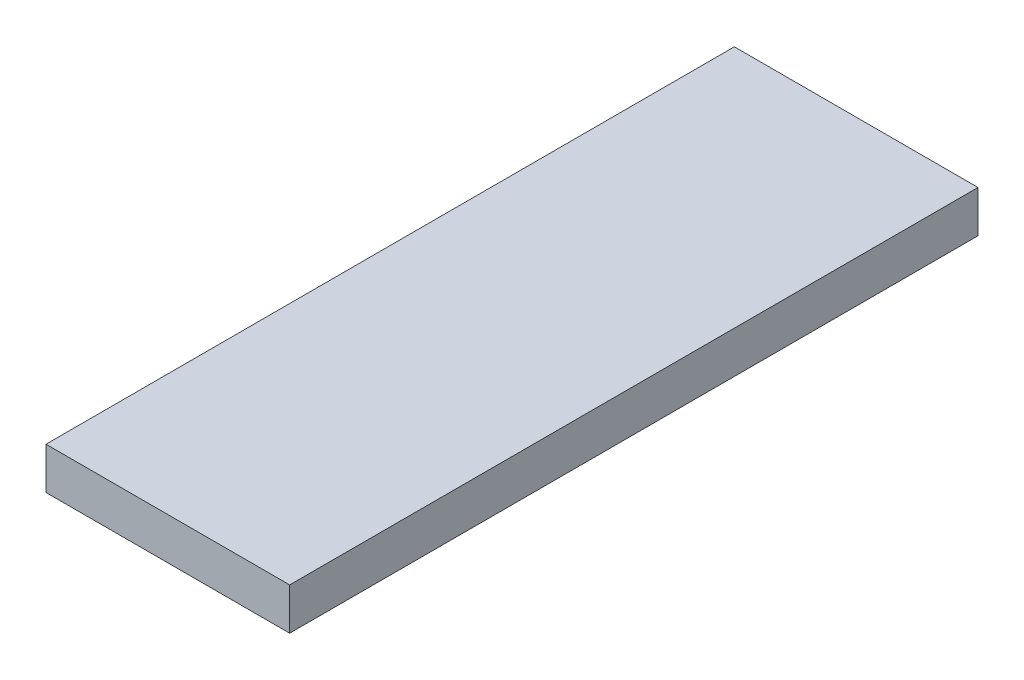
ISO-10303-21;
HEADER;
FILE_DESCRIPTION(('STEP AP214'),'2;1');
FILE_NAME('part.step','',(''),(''),'','','');
FILE_SCHEMA(('AUTOMOTIVE_DESIGN { 1 0 10303 214 1 1 1 1 }'));
ENDSEC;
DATA;
#1=APPLICATION_CONTEXT('core data for automotive mechanical design processes');
#2=APPLICATION_PROTOCOL_DEFINITION('international standard','automotive_design',2000,#1);
#3=PRODUCT_CONTEXT('',#1,'mechanical');
#4=PRODUCT('Part','Part','',(#3));
#5=PRODUCT_RELATED_PRODUCT_CATEGORY('part','',(#4));
#6=PRODUCT_DEFINITION_FORMATION('','',#4);
#7=PRODUCT_DEFINITION_CONTEXT('part definition',#1,'design');
#8=PRODUCT_DEFINITION('design','',#6,#7);
#9=PRODUCT_DEFINITION_SHAPE('','',#8);
#10=(LENGTH_UNIT() NAMED_UNIT(*) SI_UNIT(.MILLI.,.METRE.));
#11=(NAMED_UNIT(*) PLANE_ANGLE_UNIT() SI_UNIT($,.RADIAN.));
#12=(NAMED_UNIT(*) SI_UNIT($,.STERADIAN.) SOLID_ANGLE_UNIT());
#13=UNCERTAINTY_MEASURE_WITH_UNIT(LENGTH_MEASURE(1.E-05),#10,'distance_accuracy_value','');
#14=(GEOMETRIC_REPRESENTATION_CONTEXT(3) GLOBAL_UNCERTAINTY_ASSIGNED_CONTEXT((#13)) GLOBAL_UNIT_ASSIGNED_CONTEXT((#10,
#11,#12)) REPRESENTATION_CONTEXT('',''));
#15=CARTESIAN_POINT('',(0.,0.,0.));
#16=DIRECTION('',(0.,0.,1.));
#17=DIRECTION('',(1.,0.,0.));
#18=AXIS2_PLACEMENT_3D('',#15,#16,#17);
#19=CARTESIAN_POINT('',(-206.742838350957,-127.934098360656,0.));
#20=DIRECTION('',(0.,-1.,0.));
#21=DIRECTION('',(0.,0.,-1.));
#22=AXIS2_PLACEMENT_3D('',#19,#20,#21);
#23=PLANE('',#22);
#24=DIRECTION('',(0.5,0.,0.866025403784438));
#25=VECTOR('',#24,1.);
#26=CARTESIAN_POINT('',(0.989344262295071,-127.934098360656,-39.866406460551));
#27=LINE('',#26,#25);
#28=CARTESIAN_POINT('',(0.989344262295071,-127.934098360656,-39.866406460551));
#29=VERTEX_POINT('',#28);
#30=CARTESIAN_POINT('',(4.98934426229506,-127.934098360656,-32.9382032302755));
#31=VERTEX_POINT('',#30);
#32=EDGE_CURVE('E430',#29,#31,#27,.T.);
#33=ORIENTED_EDGE('',*,*,#32,.F.);
#34=DIRECTION('',(1.,0.,0.));
#35=VECTOR('',#34,1.);
#36=CARTESIAN_POINT('',(-7.01065573770493,-127.934098360656,-39.866406460551));
#37=LINE('',#36,#35);
#38=CARTESIAN_POINT('',(-7.01065573770493,-127.934098360656,-39.866406460551));
#39=VERTEX_POINT('',#38);
#40=EDGE_CURVE('E453',#39,#29,#37,.T.);
#41=ORIENTED_EDGE('',*,*,#40,.F.);
#42=DIRECTION('',(0.500000000000001,0.,-0.866025403784438));
#43=VECTOR('',#42,1.);
#44=CARTESIAN_POINT('',(-11.0106557377049,-127.934098360656,-32.9382032302755));
#45=LINE('',#44,#43);
#46=CARTESIAN_POINT('',(-11.0106557377049,-127.934098360656,-32.9382032302755));
#47=VERTEX_POINT('',#46);
#48=EDGE_CURVE('E484',#47,#39,#45,.T.);
#49=ORIENTED_EDGE('',*,*,#48,.F.);
#50=DIRECTION('',(-0.485739165099543,0.,-0.874103805899734));
#51=VECTOR('',#50,1.);
#52=CARTESIAN_POINT('',(-7.16065573770493,-127.934098360656,-26.01));
#53=LINE('',#52,#51);
#54=CARTESIAN_POINT('',(-7.16065573770493,-127.934098360656,-26.01));
#55=VERTEX_POINT('',#54);
#56=EDGE_CURVE('E480',#55,#47,#53,.T.);
#57=ORIENTED_EDGE('',*,*,#56,.F.);
#58=DIRECTION('',(-1.,0.,0.));
#59=VECTOR('',#58,1.);
#60=CARTESIAN_POINT('',(1.13934426229507,-127.934098360656,-26.01));
#61=LINE('',#60,#59);
#62=CARTESIAN_POINT('',(1.13934426229507,-127.934098360656,-26.01));
#63=VERTEX_POINT('',#62);
#64=EDGE_CURVE('E476',#63,#55,#61,.T.);
#65=ORIENTED_EDGE('',*,*,#64,.F.);
#66=DIRECTION('',(-0.485739165099541,0.,0.874103805899734));
#67=VECTOR('',#66,1.);
#68=CARTESIAN_POINT('',(4.98934426229506,-127.934098360656,-32.9382032302755));
#69=LINE('',#68,#67);
#70=EDGE_CURVE('E472',#31,#63,#69,.T.);
#71=ORIENTED_EDGE('',*,*,#70,.F.);
#72=EDGE_LOOP('',(#33,#41,#49,#57,#65,#71));
#73=FACE_BOUND('',#72,.T.);
#74=DIRECTION('',(0.,0.,1.));
#75=VECTOR('',#74,1.);
#76=CARTESIAN_POINT('',(-23.3606557377049,-127.934098360656,0.));
#77=LINE('',#76,#75);
#78=CARTESIAN_POINT('',(-23.3606557377049,-127.934098360656,-80.));
#79=VERTEX_POINT('',#78);
#80=CARTESIAN_POINT('',(-23.3606557377049,-127.934098360656,33.));
#81=VERTEX_POINT('',#80);
#82=EDGE_CURVE('E11',#79,#81,#77,.T.);
#83=ORIENTED_EDGE('',*,*,#82,.F.);
#84=DIRECTION('',(1.,0.,0.));
#85=VECTOR('',#84,1.);
#86=CARTESIAN_POINT('',(-206.742838350957,-127.934098360656,-80.));
#87=LINE('',#86,#85);
#88=CARTESIAN_POINT('',(16.6393442622951,-127.934098360656,-80.));
#89=VERTEX_POINT('',#88);
#90=EDGE_CURVE('E517',#79,#89,#87,.T.);
#91=ORIENTED_EDGE('',*,*,#90,.T.);
#92=DIRECTION('',(0.,0.,-1.));
#93=VECTOR('',#92,1.);
#94=CARTESIAN_POINT('',(16.6393442622951,-127.934098360656,0.));
#95=LINE('',#94,#93);
#96=CARTESIAN_POINT('',(16.6393442622951,-127.934098360656,33.));
#97=VERTEX_POINT('',#96);
#98=EDGE_CURVE('E256',#97,#89,#95,.T.);
#99=ORIENTED_EDGE('',*,*,#98,.F.);
#100=DIRECTION('',(1.,0.,0.));
#101=VECTOR('',#100,1.);
#102=CARTESIAN_POINT('',(-206.742838350957,-127.934098360656,33.));
#103=LINE('',#102,#101);
#104=EDGE_CURVE('E53',#81,#97,#103,.T.);
#105=ORIENTED_EDGE('',*,*,#104,.F.);
#106=EDGE_LOOP('',(#83,#91,#99,#105));
#107=FACE_BOUND('',#106,.T.);
#108=DIRECTION('',(-0.5,0.,0.866025403784438));
#109=VECTOR('',#108,1.);
#110=CARTESIAN_POINT('',(4.83934426229505,-127.934098360656,-52.9867967697245));
#111=LINE('',#110,#109);
#112=CARTESIAN_POINT('',(4.83934426229505,-127.934098360656,-52.9867967697245));
#113=VERTEX_POINT('',#112);
#114=CARTESIAN_POINT('',(0.839344262295044,-127.934098360656,-46.058593539449));
#115=VERTEX_POINT('',#114);
#116=EDGE_CURVE('E423',#113,#115,#111,.T.);
#117=ORIENTED_EDGE('',*,*,#116,.F.);
#118=DIRECTION('',(0.499999999999999,0.,0.866025403784439));
#119=VECTOR('',#118,1.);
#120=CARTESIAN_POINT('',(0.839344262295077,-127.934098360656,-59.915));
#121=LINE('',#120,#119);
#122=CARTESIAN_POINT('',(0.839344262295077,-127.934098360656,-59.915));
#123=VERTEX_POINT('',#122);
#124=EDGE_CURVE('E426',#123,#113,#121,.T.);
#125=ORIENTED_EDGE('',*,*,#124,.F.);
#126=DIRECTION('',(1.,0.,0.));
#127=VECTOR('',#126,1.);
#128=CARTESIAN_POINT('',(-7.16065573770492,-127.934098360656,-59.915));
#129=LINE('',#128,#127);
#130=CARTESIAN_POINT('',(-7.16065573770491,-127.934098360656,-59.915));
#131=VERTEX_POINT('',#130);
#132=EDGE_CURVE('E409',#131,#123,#129,.T.);
#133=ORIENTED_EDGE('',*,*,#132,.F.);
#134=DIRECTION('',(0.5,0.,-0.866025403784439));
#135=VECTOR('',#134,1.);
#136=CARTESIAN_POINT('',(-11.1606557377049,-127.934098360656,-52.9867967697245));
#137=LINE('',#136,#135);
#138=CARTESIAN_POINT('',(-11.1606557377049,-127.934098360656,-52.9867967697245));
#139=VERTEX_POINT('',#138);
#140=EDGE_CURVE('E412',#139,#131,#137,.T.);
#141=ORIENTED_EDGE('',*,*,#140,.F.);
#142=DIRECTION('',(-0.5,0.,-0.866025403784439));
#143=VECTOR('',#142,1.);
#144=CARTESIAN_POINT('',(-7.16065573770493,-127.934098360656,-46.058593539449));
#145=LINE('',#144,#143);
#146=CARTESIAN_POINT('',(-7.16065573770493,-127.934098360656,-46.058593539449));
#147=VERTEX_POINT('',#146);
#148=EDGE_CURVE('E417',#147,#139,#145,.T.);
#149=ORIENTED_EDGE('',*,*,#148,.F.);
#150=DIRECTION('',(-1.,0.,0.));
#151=VECTOR('',#150,1.);
#152=CARTESIAN_POINT('',(0.839344262295044,-127.934098360656,-46.058593539449));
#153=LINE('',#152,#151);
#154=EDGE_CURVE('E420',#115,#147,#153,.T.);
#155=ORIENTED_EDGE('',*,*,#154,.F.);
#156=EDGE_LOOP('',(#117,#125,#133,#141,#149,#155));
#157=FACE_BOUND('',#156,.T.);
#158=DIRECTION('',(-0.499999999999999,0.,0.866025403784439));
#159=VECTOR('',#158,1.);
#160=CARTESIAN_POINT('',(4.83934426229506,-127.934098360656,-13.0289838502755));
#161=LINE('',#160,#159);
#162=CARTESIAN_POINT('',(4.83934426229506,-127.934098360656,-13.0289838502755));
#163=VERTEX_POINT('',#162);
#164=CARTESIAN_POINT('',(0.839344262295067,-127.934098360656,-6.10078062000001));
#165=VERTEX_POINT('',#164);
#166=EDGE_CURVE('E362',#163,#165,#161,.T.);
#167=ORIENTED_EDGE('',*,*,#166,.F.);
#168=DIRECTION('',(0.5,0.,0.866025403784439));
#169=VECTOR('',#168,1.);
#170=CARTESIAN_POINT('',(0.839344262295073,-127.934098360656,-19.957187080551));
#171=LINE('',#170,#169);
#172=CARTESIAN_POINT('',(0.839344262295073,-127.934098360656,-19.957187080551));
#173=VERTEX_POINT('',#172);
#174=EDGE_CURVE('E365',#173,#163,#171,.T.);
#175=ORIENTED_EDGE('',*,*,#174,.F.);
#176=DIRECTION('',(1.,0.,0.));
#177=VECTOR('',#176,1.);
#178=CARTESIAN_POINT('',(-7.16065573770492,-127.934098360656,-19.957187080551));
#179=LINE('',#178,#177);
#180=CARTESIAN_POINT('',(-7.16065573770491,-127.934098360656,-19.957187080551));
#181=VERTEX_POINT('',#180);
#182=EDGE_CURVE('E348',#181,#173,#179,.T.);
#183=ORIENTED_EDGE('',*,*,#182,.F.);
#184=DIRECTION('',(0.5,0.,-0.866025403784438));
#185=VECTOR('',#184,1.);
#186=CARTESIAN_POINT('',(-11.1606557377049,-127.934098360656,-13.0289838502755));
#187=LINE('',#186,#185);
#188=CARTESIAN_POINT('',(-11.1606557377049,-127.934098360656,-13.0289838502755));
#189=VERTEX_POINT('',#188);
#190=EDGE_CURVE('E351',#189,#181,#187,.T.);
#191=ORIENTED_EDGE('',*,*,#190,.F.);
#192=DIRECTION('',(-0.5,0.,-0.866025403784439));
#193=VECTOR('',#192,1.);
#194=CARTESIAN_POINT('',(-7.16065573770493,-127.934098360656,-6.10078062000001));
#195=LINE('',#194,#193);
#196=CARTESIAN_POINT('',(-7.16065573770493,-127.934098360656,-6.10078062000001));
#197=VERTEX_POINT('',#196);
#198=EDGE_CURVE('E356',#197,#189,#195,.T.);
#199=ORIENTED_EDGE('',*,*,#198,.F.);
#200=DIRECTION('',(-1.,0.,0.));
#201=VECTOR('',#200,1.);
#202=CARTESIAN_POINT('',(0.839344262295067,-127.934098360656,-6.10078062000001));
#203=LINE('',#202,#201);
#204=EDGE_CURVE('E359',#165,#197,#203,.T.);
#205=ORIENTED_EDGE('',*,*,#204,.F.);
#206=EDGE_LOOP('',(#167,#175,#183,#191,#199,#205));
#207=FACE_BOUND('',#206,.T.);
#208=DIRECTION('',(-0.499999999999998,0.,0.86602540378444));
#209=VECTOR('',#208,1.);
#210=CARTESIAN_POINT('',(4.83934426229505,-127.934098360656,6.97179676972448));
#211=LINE('',#210,#209);
#212=CARTESIAN_POINT('',(4.83934426229505,-127.934098360656,6.97179676972448));
#213=VERTEX_POINT('',#212);
#214=CARTESIAN_POINT('',(0.839344262295068,-127.934098360656,13.9));
#215=VERTEX_POINT('',#214);
#216=EDGE_CURVE('E301',#213,#215,#211,.T.);
#217=ORIENTED_EDGE('',*,*,#216,.F.);
#218=DIRECTION('',(0.5,0.,0.866025403784439));
#219=VECTOR('',#218,1.);
#220=CARTESIAN_POINT('',(0.839344262295062,-127.934098360656,0.0435935394489913));
#221=LINE('',#220,#219);
#222=CARTESIAN_POINT('',(0.839344262295062,-127.934098360656,0.0435935394489913));
#223=VERTEX_POINT('',#222);
#224=EDGE_CURVE('E304',#223,#213,#221,.T.);
#225=ORIENTED_EDGE('',*,*,#224,.F.);
#226=DIRECTION('',(1.,0.,0.));
#227=VECTOR('',#226,1.);
#228=CARTESIAN_POINT('',(-7.16065573770492,-127.934098360656,0.0435935394489894));
#229=LINE('',#228,#227);
#230=CARTESIAN_POINT('',(-7.16065573770491,-127.934098360656,0.0435935394489894));
#231=VERTEX_POINT('',#230);
#232=EDGE_CURVE('E288',#231,#223,#229,.T.);
#233=ORIENTED_EDGE('',*,*,#232,.F.);
#234=DIRECTION('',(0.5,0.,-0.866025403784438));
#235=VECTOR('',#234,1.);
#236=CARTESIAN_POINT('',(-11.1606557377049,-127.934098360656,6.97179676972449));
#237=LINE('',#236,#235);
#238=CARTESIAN_POINT('',(-11.1606557377049,-127.934098360656,6.97179676972449));
#239=VERTEX_POINT('',#238);
#240=EDGE_CURVE('E291',#239,#231,#237,.T.);
#241=ORIENTED_EDGE('',*,*,#240,.F.);
#242=DIRECTION('',(-0.5,0.,-0.866025403784439));
#243=VECTOR('',#242,1.);
#244=CARTESIAN_POINT('',(-7.16065573770493,-127.934098360656,13.9));
#245=LINE('',#244,#243);
#246=CARTESIAN_POINT('',(-7.16065573770493,-127.934098360656,13.9));
#247=VERTEX_POINT('',#246);
#248=EDGE_CURVE('E295',#247,#239,#245,.T.);
#249=ORIENTED_EDGE('',*,*,#248,.F.);
#250=DIRECTION('',(-1.,0.,0.));
#251=VECTOR('',#250,1.);
#252=CARTESIAN_POINT('',(0.839344262295068,-127.934098360656,13.9));
#253=LINE('',#252,#251);
#254=EDGE_CURVE('E298',#215,#247,#253,.T.);
#255=ORIENTED_EDGE('',*,*,#254,.F.);
#256=EDGE_LOOP('',(#217,#225,#233,#241,#249,#255));
#257=FACE_BOUND('',#256,.T.);
#258=ADVANCED_FACE('F49',(#73,#107,#157,#207,#257),#23,.T.);
#259=CARTESIAN_POINT('',(16.6393442622951,0.,8.));
#260=DIRECTION('',(1.,0.,0.));
#261=DIRECTION('',(0.,0.,-1.));
#262=AXIS2_PLACEMENT_3D('',#259,#260,#261);
#263=PLANE('',#262);
#264=DIRECTION('',(0.,0.,-1.));
#265=VECTOR('',#264,1.);
#266=CARTESIAN_POINT('',(16.6393442622951,-121.064597804361,33.));
#267=LINE('',#266,#265);
#268=CARTESIAN_POINT('',(16.6393442622951,-121.064597804361,33.));
#269=VERTEX_POINT('',#268);
#270=CARTESIAN_POINT('',(16.6393442622951,-121.064597804361,-80.));
#271=VERTEX_POINT('',#270);
#272=EDGE_CURVE('E235',#269,#271,#267,.T.);
#273=ORIENTED_EDGE('',*,*,#272,.F.);
#274=DIRECTION('',(0.,-1.,0.));
#275=VECTOR('',#274,1.);
#276=CARTESIAN_POINT('',(16.6393442622951,-79.8643960179936,33.));
#277=LINE('',#276,#275);
#278=EDGE_CURVE('E514',#269,#97,#277,.T.);
#279=ORIENTED_EDGE('',*,*,#278,.T.);
#280=ORIENTED_EDGE('',*,*,#98,.T.);
#281=DIRECTION('',(0.,1.,0.));
#282=VECTOR('',#281,1.);
#283=CARTESIAN_POINT('',(16.6393442622951,0.,-80.));
#284=LINE('',#283,#282);
#285=EDGE_CURVE('E250',#89,#271,#284,.T.);
#286=ORIENTED_EDGE('',*,*,#285,.T.);
#287=EDGE_LOOP('',(#273,#279,#280,#286));
#288=FACE_BOUND('',#287,.T.);
#289=ADVANCED_FACE('F51',(#288),#263,.T.);
#290=CARTESIAN_POINT('',(-23.3606557377049,0.,8.));
#291=DIRECTION('',(1.,0.,0.));
#292=DIRECTION('',(0.,1.,0.));
#293=AXIS2_PLACEMENT_3D('',#290,#291,#292);
#294=PLANE('',#293);
#295=DIRECTION('',(0.,1.,0.));
#296=VECTOR('',#295,1.);
#297=CARTESIAN_POINT('',(-23.3606557377049,-79.8643960179936,33.));
#298=LINE('',#297,#296);
#299=CARTESIAN_POINT('',(-23.3606557377049,-121.064597804361,33.));
#300=VERTEX_POINT('',#299);
#301=EDGE_CURVE('E59',#81,#300,#298,.T.);
#302=ORIENTED_EDGE('',*,*,#301,.T.);
#303=DIRECTION('',(0.,0.,-1.));
#304=VECTOR('',#303,1.);
#305=CARTESIAN_POINT('',(-23.3606557377049,-121.064597804361,33.));
#306=LINE('',#305,#304);
#307=CARTESIAN_POINT('',(-23.3606557377049,-121.064597804361,-80.));
#308=VERTEX_POINT('',#307);
#309=EDGE_CURVE('E67',#300,#308,#306,.T.);
#310=ORIENTED_EDGE('',*,*,#309,.T.);
#311=DIRECTION('',(0.,-1.,0.));
#312=VECTOR('',#311,1.);
#313=CARTESIAN_POINT('',(-23.3606557377049,0.,-80.));
#314=LINE('',#313,#312);
#315=EDGE_CURVE('E244',#308,#79,#314,.T.);
#316=ORIENTED_EDGE('',*,*,#315,.T.);
#317=ORIENTED_EDGE('',*,*,#82,.T.);
#318=EDGE_LOOP('',(#302,#310,#316,#317));
#319=FACE_BOUND('',#318,.T.);
#320=ADVANCED_FACE('F670',(#319),#294,.F.);
#321=CARTESIAN_POINT('',(-206.742838350957,-79.8643960179936,33.));
#322=DIRECTION('',(0.,0.,1.));
#323=DIRECTION('',(1.,0.,0.));
#324=AXIS2_PLACEMENT_3D('',#321,#322,#323);
#325=PLANE('',#324);
#326=DIRECTION('',(1.,0.,0.));
#327=VECTOR('',#326,1.);
#328=CARTESIAN_POINT('',(-23.3606557377049,-121.064597804361,33.));
#329=LINE('',#328,#327);
#330=EDGE_CURVE('E239',#300,#269,#329,.T.);
#331=ORIENTED_EDGE('',*,*,#330,.F.);
#332=ORIENTED_EDGE('',*,*,#301,.F.);
#333=ORIENTED_EDGE('',*,*,#104,.T.);
#334=ORIENTED_EDGE('',*,*,#278,.F.);
#335=EDGE_LOOP('',(#331,#332,#333,#334));
#336=FACE_BOUND('',#335,.T.);
#337=ADVANCED_FACE('F530',(#336),#325,.T.);
#338=CARTESIAN_POINT('',(0.989344262295071,-137.934098360656,-39.866406460551));
#339=DIRECTION('',(-0.866025403784438,0.,0.5));
#340=DIRECTION('',(0.5,0.,0.866025403784439));
#341=AXIS2_PLACEMENT_3D('',#338,#339,#340);
#342=PLANE('',#341);
#343=ORIENTED_EDGE('',*,*,#32,.T.);
#344=DIRECTION('',(0.,1.,0.));
#345=VECTOR('',#344,1.);
#346=CARTESIAN_POINT('',(4.98934426229506,-137.934098360656,-32.9382032302755));
#347=LINE('',#346,#345);
#348=CARTESIAN_POINT('',(4.98934426229506,-137.934098360656,-32.9382032302755));
#349=VERTEX_POINT('',#348);
#350=EDGE_CURVE('E510',#349,#31,#347,.T.);
#351=ORIENTED_EDGE('',*,*,#350,.F.);
#352=DIRECTION('',(0.5,0.,0.866025403784438));
#353=VECTOR('',#352,1.);
#354=CARTESIAN_POINT('',(0.989344262295071,-137.934098360656,-39.866406460551));
#355=LINE('',#354,#353);
#356=CARTESIAN_POINT('',(0.989344262295071,-137.934098360656,-39.866406460551));
#357=VERTEX_POINT('',#356);
#358=EDGE_CURVE('E448',#357,#349,#355,.T.);
#359=ORIENTED_EDGE('',*,*,#358,.F.);
#360=DIRECTION('',(0.,1.,0.));
#361=VECTOR('',#360,1.);
#362=CARTESIAN_POINT('',(0.989344262295071,-137.934098360656,-39.866406460551));
#363=LINE('',#362,#361);
#364=EDGE_CURVE('E468',#357,#29,#363,.T.);
#365=ORIENTED_EDGE('',*,*,#364,.T.);
#366=EDGE_LOOP('',(#343,#351,#359,#365));
#367=FACE_BOUND('',#366,.T.);
#368=ADVANCED_FACE('F664',(#367),#342,.F.);
#369=CARTESIAN_POINT('',(4.98934426229506,-137.934098360656,-32.9382032302755));
#370=DIRECTION('',(-0.874103805899734,0.,-0.485739165099541));
#371=DIRECTION('',(-0.485739165099541,0.,0.874103805899735));
#372=AXIS2_PLACEMENT_3D('',#369,#370,#371);
#373=PLANE('',#372);
#374=ORIENTED_EDGE('',*,*,#70,.T.);
#375=DIRECTION('',(0.,1.,0.));
#376=VECTOR('',#375,1.);
#377=CARTESIAN_POINT('',(1.13934426229507,-137.934098360656,-26.01));
#378=LINE('',#377,#376);
#379=CARTESIAN_POINT('',(1.13934426229507,-137.934098360656,-26.01));
#380=VERTEX_POINT('',#379);
#381=EDGE_CURVE('E506',#380,#63,#378,.T.);
#382=ORIENTED_EDGE('',*,*,#381,.F.);
#383=DIRECTION('',(-0.485739165099541,0.,0.874103805899734));
#384=VECTOR('',#383,1.);
#385=CARTESIAN_POINT('',(4.98934426229506,-137.934098360656,-32.9382032302755));
#386=LINE('',#385,#384);
#387=EDGE_CURVE('E452',#349,#380,#386,.T.);
#388=ORIENTED_EDGE('',*,*,#387,.F.);
#389=ORIENTED_EDGE('',*,*,#350,.T.);
#390=EDGE_LOOP('',(#374,#382,#388,#389));
#391=FACE_BOUND('',#390,.T.);
#392=ADVANCED_FACE('F660',(#391),#373,.F.);
#393=CARTESIAN_POINT('',(1.13934426229507,-137.934098360656,-26.01));
#394=DIRECTION('',(0.,0.,-1.));
#395=DIRECTION('',(-1.,0.,0.));
#396=AXIS2_PLACEMENT_3D('',#393,#394,#395);
#397=PLANE('',#396);
#398=ORIENTED_EDGE('',*,*,#64,.T.);
#399=DIRECTION('',(0.,1.,0.));
#400=VECTOR('',#399,1.);
#401=CARTESIAN_POINT('',(-7.16065573770493,-137.934098360656,-26.01));
#402=LINE('',#401,#400);
#403=CARTESIAN_POINT('',(-7.16065573770493,-137.934098360656,-26.01));
#404=VERTEX_POINT('',#403);
#405=EDGE_CURVE('E502',#404,#55,#402,.T.);
#406=ORIENTED_EDGE('',*,*,#405,.F.);
#407=DIRECTION('',(-1.,0.,0.));
#408=VECTOR('',#407,1.);
#409=CARTESIAN_POINT('',(1.13934426229507,-137.934098360656,-26.01));
#410=LINE('',#409,#408);
#411=EDGE_CURVE('E456',#380,#404,#410,.T.);
#412=ORIENTED_EDGE('',*,*,#411,.F.);
#413=ORIENTED_EDGE('',*,*,#381,.T.);
#414=EDGE_LOOP('',(#398,#406,#412,#413));
#415=FACE_BOUND('',#414,.T.);
#416=ADVANCED_FACE('F656',(#415),#397,.F.);
#417=CARTESIAN_POINT('',(-7.16065573770493,-137.934098360656,-26.01));
#418=DIRECTION('',(0.874103805899734,0.,-0.485739165099543));
#419=DIRECTION('',(-0.485739165099543,0.,-0.874103805899734));
#420=AXIS2_PLACEMENT_3D('',#417,#418,#419);
#421=PLANE('',#420);
#422=ORIENTED_EDGE('',*,*,#56,.T.);
#423=DIRECTION('',(0.,1.,0.));
#424=VECTOR('',#423,1.);
#425=CARTESIAN_POINT('',(-11.0106557377049,-137.934098360656,-32.9382032302755));
#426=LINE('',#425,#424);
#427=CARTESIAN_POINT('',(-11.0106557377049,-137.934098360656,-32.9382032302755));
#428=VERTEX_POINT('',#427);
#429=EDGE_CURVE('E498',#428,#47,#426,.T.);
#430=ORIENTED_EDGE('',*,*,#429,.F.);
#431=DIRECTION('',(-0.485739165099543,0.,-0.874103805899734));
#432=VECTOR('',#431,1.);
#433=CARTESIAN_POINT('',(-7.16065573770493,-137.934098360656,-26.01));
#434=LINE('',#433,#432);
#435=EDGE_CURVE('E459',#404,#428,#434,.T.);
#436=ORIENTED_EDGE('',*,*,#435,.F.);
#437=ORIENTED_EDGE('',*,*,#405,.T.);
#438=EDGE_LOOP('',(#422,#430,#436,#437));
#439=FACE_BOUND('',#438,.T.);
#440=ADVANCED_FACE('F652',(#439),#421,.F.);
#441=CARTESIAN_POINT('',(-11.0106557377049,-137.934098360656,-32.9382032302755));
#442=DIRECTION('',(0.866025403784438,0.,0.500000000000001));
#443=DIRECTION('',(0.500000000000001,0.,-0.866025403784438));
#444=AXIS2_PLACEMENT_3D('',#441,#442,#443);
#445=PLANE('',#444);
#446=ORIENTED_EDGE('',*,*,#48,.T.);
#447=DIRECTION('',(0.,1.,0.));
#448=VECTOR('',#447,1.);
#449=CARTESIAN_POINT('',(-7.01065573770493,-137.934098360656,-39.866406460551));
#450=LINE('',#449,#448);
#451=CARTESIAN_POINT('',(-7.01065573770493,-137.934098360656,-39.866406460551));
#452=VERTEX_POINT('',#451);
#453=EDGE_CURVE('E494',#452,#39,#450,.T.);
#454=ORIENTED_EDGE('',*,*,#453,.F.);
#455=DIRECTION('',(0.500000000000001,0.,-0.866025403784438));
#456=VECTOR('',#455,1.);
#457=CARTESIAN_POINT('',(-11.0106557377049,-137.934098360656,-32.9382032302755));
#458=LINE('',#457,#456);
#459=EDGE_CURVE('E462',#428,#452,#458,.T.);
#460=ORIENTED_EDGE('',*,*,#459,.F.);
#461=ORIENTED_EDGE('',*,*,#429,.T.);
#462=EDGE_LOOP('',(#446,#454,#460,#461));
#463=FACE_BOUND('',#462,.T.);
#464=ADVANCED_FACE('F648',(#463),#445,.F.);
#465=CARTESIAN_POINT('',(-7.01065573770493,-137.934098360656,-39.866406460551));
#466=DIRECTION('',(0.,0.,1.));
#467=DIRECTION('',(1.,0.,0.));
#468=AXIS2_PLACEMENT_3D('',#465,#466,#467);
#469=PLANE('',#468);
#470=ORIENTED_EDGE('',*,*,#40,.T.);
#471=ORIENTED_EDGE('',*,*,#364,.F.);
#472=DIRECTION('',(1.,0.,0.));
#473=VECTOR('',#472,1.);
#474=CARTESIAN_POINT('',(-7.01065573770493,-137.934098360656,-39.866406460551));
#475=LINE('',#474,#473);
#476=EDGE_CURVE('E465',#452,#357,#475,.T.);
#477=ORIENTED_EDGE('',*,*,#476,.F.);
#478=ORIENTED_EDGE('',*,*,#453,.T.);
#479=EDGE_LOOP('',(#470,#471,#477,#478));
#480=FACE_BOUND('',#479,.T.);
#481=ADVANCED_FACE('F644',(#480),#469,.F.);
#482=CARTESIAN_POINT('',(0.,-137.934098360656,0.));
#483=DIRECTION('',(0.,-1.,0.));
#484=DIRECTION('',(0.,0.,-1.));
#485=AXIS2_PLACEMENT_3D('',#482,#483,#484);
#486=PLANE('',#485);
#487=ORIENTED_EDGE('',*,*,#358,.T.);
#488=ORIENTED_EDGE('',*,*,#387,.T.);
#489=ORIENTED_EDGE('',*,*,#411,.T.);
#490=ORIENTED_EDGE('',*,*,#435,.T.);
#491=ORIENTED_EDGE('',*,*,#459,.T.);
#492=ORIENTED_EDGE('',*,*,#476,.T.);
#493=EDGE_LOOP('',(#487,#488,#489,#490,#491,#492));
#494=FACE_BOUND('',#493,.T.);
#495=ADVANCED_FACE('F618',(#494),#486,.T.);
#496=CARTESIAN_POINT('',(0.839344262295077,-137.934098360656,-59.915));
#497=DIRECTION('',(-0.866025403784439,0.,0.499999999999999));
#498=DIRECTION('',(0.499999999999999,0.,0.866025403784439));
#499=AXIS2_PLACEMENT_3D('',#496,#497,#498);
#500=PLANE('',#499);
#501=ORIENTED_EDGE('',*,*,#124,.T.);
#502=DIRECTION('',(0.,1.,0.));
#503=VECTOR('',#502,1.);
#504=CARTESIAN_POINT('',(4.83934426229505,-137.934098360656,-52.9867967697245));
#505=LINE('',#504,#503);
#506=CARTESIAN_POINT('',(4.83934426229505,-137.934098360656,-52.9867967697245));
#507=VERTEX_POINT('',#506);
#508=EDGE_CURVE('E369',#507,#113,#505,.T.);
#509=ORIENTED_EDGE('',*,*,#508,.F.);
#510=DIRECTION('',(0.499999999999999,0.,0.866025403784439));
#511=VECTOR('',#510,1.);
#512=CARTESIAN_POINT('',(0.839344262295077,-137.934098360656,-59.915));
#513=LINE('',#512,#511);
#514=CARTESIAN_POINT('',(0.839344262295077,-137.934098360656,-59.915));
#515=VERTEX_POINT('',#514);
#516=EDGE_CURVE('E413',#515,#507,#513,.T.);
#517=ORIENTED_EDGE('',*,*,#516,.F.);
#518=DIRECTION('',(0.,1.,0.));
#519=VECTOR('',#518,1.);
#520=CARTESIAN_POINT('',(0.839344262295077,-137.934098360656,-59.915));
#521=LINE('',#520,#519);
#522=EDGE_CURVE('E404',#515,#123,#521,.T.);
#523=ORIENTED_EDGE('',*,*,#522,.T.);
#524=EDGE_LOOP('',(#501,#509,#517,#523));
#525=FACE_BOUND('',#524,.T.);
#526=ADVANCED_FACE('F614',(#525),#500,.F.);
#527=CARTESIAN_POINT('',(4.83934426229505,-137.934098360656,-52.9867967697245));
#528=DIRECTION('',(-0.866025403784438,0.,-0.5));
#529=DIRECTION('',(-0.5,0.,0.866025403784439));
#530=AXIS2_PLACEMENT_3D('',#527,#528,#529);
#531=PLANE('',#530);
#532=ORIENTED_EDGE('',*,*,#116,.T.);
#533=DIRECTION('',(0.,1.,0.));
#534=VECTOR('',#533,1.);
#535=CARTESIAN_POINT('',(0.839344262295044,-137.934098360656,-46.058593539449));
#536=LINE('',#535,#534);
#537=CARTESIAN_POINT('',(0.839344262295044,-137.934098360656,-46.058593539449));
#538=VERTEX_POINT('',#537);
#539=EDGE_CURVE('E389',#538,#115,#536,.T.);
#540=ORIENTED_EDGE('',*,*,#539,.F.);
#541=DIRECTION('',(-0.5,0.,0.866025403784438));
#542=VECTOR('',#541,1.);
#543=CARTESIAN_POINT('',(4.83934426229505,-137.934098360656,-52.9867967697245));
#544=LINE('',#543,#542);
#545=EDGE_CURVE('E442',#507,#538,#544,.T.);
#546=ORIENTED_EDGE('',*,*,#545,.F.);
#547=ORIENTED_EDGE('',*,*,#508,.T.);
#548=EDGE_LOOP('',(#532,#540,#546,#547));
#549=FACE_BOUND('',#548,.T.);
#550=ADVANCED_FACE('F617',(#549),#531,.F.);
#551=CARTESIAN_POINT('',(0.839344262295044,-137.934098360656,-46.058593539449));
#552=DIRECTION('',(0.,0.,-1.));
#553=DIRECTION('',(-1.,0.,0.));
#554=AXIS2_PLACEMENT_3D('',#551,#552,#553);
#555=PLANE('',#554);
#556=ORIENTED_EDGE('',*,*,#154,.T.);
#557=DIRECTION('',(0.,1.,0.));
#558=VECTOR('',#557,1.);
#559=CARTESIAN_POINT('',(-7.16065573770493,-137.934098360656,-46.058593539449));
#560=LINE('',#559,#558);
#561=CARTESIAN_POINT('',(-7.16065573770493,-137.934098360656,-46.058593539449));
#562=VERTEX_POINT('',#561);
#563=EDGE_CURVE('E393',#562,#147,#560,.T.);
#564=ORIENTED_EDGE('',*,*,#563,.F.);
#565=DIRECTION('',(-1.,0.,0.));
#566=VECTOR('',#565,1.);
#567=CARTESIAN_POINT('',(0.839344262295044,-137.934098360656,-46.058593539449));
#568=LINE('',#567,#566);
#569=EDGE_CURVE('E439',#538,#562,#568,.T.);
#570=ORIENTED_EDGE('',*,*,#569,.F.);
#571=ORIENTED_EDGE('',*,*,#539,.T.);
#572=EDGE_LOOP('',(#556,#564,#570,#571));
#573=FACE_BOUND('',#572,.T.);
#574=ADVANCED_FACE('F622',(#573),#555,.F.);
#575=CARTESIAN_POINT('',(-7.16065573770493,-137.934098360656,-46.058593539449));
#576=DIRECTION('',(0.866025403784439,0.,-0.5));
#577=DIRECTION('',(-0.5,0.,-0.866025403784439));
#578=AXIS2_PLACEMENT_3D('',#575,#576,#577);
#579=PLANE('',#578);
#580=ORIENTED_EDGE('',*,*,#148,.T.);
#581=DIRECTION('',(0.,1.,0.));
#582=VECTOR('',#581,1.);
#583=CARTESIAN_POINT('',(-11.1606557377049,-137.934098360656,-52.9867967697245));
#584=LINE('',#583,#582);
#585=CARTESIAN_POINT('',(-11.1606557377049,-137.934098360656,-52.9867967697245));
#586=VERTEX_POINT('',#585);
#587=EDGE_CURVE('E397',#586,#139,#584,.T.);
#588=ORIENTED_EDGE('',*,*,#587,.F.);
#589=DIRECTION('',(-0.5,0.,-0.866025403784439));
#590=VECTOR('',#589,1.);
#591=CARTESIAN_POINT('',(-7.16065573770493,-137.934098360656,-46.058593539449));
#592=LINE('',#591,#590);
#593=EDGE_CURVE('E436',#562,#586,#592,.T.);
#594=ORIENTED_EDGE('',*,*,#593,.F.);
#595=ORIENTED_EDGE('',*,*,#563,.T.);
#596=EDGE_LOOP('',(#580,#588,#594,#595));
#597=FACE_BOUND('',#596,.T.);
#598=ADVANCED_FACE('F626',(#597),#579,.F.);
#599=CARTESIAN_POINT('',(-11.1606557377049,-137.934098360656,-52.9867967697245));
#600=DIRECTION('',(0.866025403784439,0.,0.5));
#601=DIRECTION('',(0.5,0.,-0.866025403784439));
#602=AXIS2_PLACEMENT_3D('',#599,#600,#601);
#603=PLANE('',#602);
#604=ORIENTED_EDGE('',*,*,#140,.T.);
#605=DIRECTION('',(0.,1.,0.));
#606=VECTOR('',#605,1.);
#607=CARTESIAN_POINT('',(-7.16065573770492,-137.934098360656,-59.915));
#608=LINE('',#607,#606);
#609=CARTESIAN_POINT('',(-7.16065573770492,-137.934098360656,-59.915));
#610=VERTEX_POINT('',#609);
#611=EDGE_CURVE('E401',#610,#131,#608,.T.);
#612=ORIENTED_EDGE('',*,*,#611,.F.);
#613=DIRECTION('',(0.5,0.,-0.866025403784439));
#614=VECTOR('',#613,1.);
#615=CARTESIAN_POINT('',(-11.1606557377049,-137.934098360656,-52.9867967697245));
#616=LINE('',#615,#614);
#617=EDGE_CURVE('E433',#586,#610,#616,.T.);
#618=ORIENTED_EDGE('',*,*,#617,.F.);
#619=ORIENTED_EDGE('',*,*,#587,.T.);
#620=EDGE_LOOP('',(#604,#612,#618,#619));
#621=FACE_BOUND('',#620,.T.);
#622=ADVANCED_FACE('F630',(#621),#603,.F.);
#623=CARTESIAN_POINT('',(-7.16065573770492,-137.934098360656,-59.915));
#624=DIRECTION('',(0.,0.,1.));
#625=DIRECTION('',(1.,0.,0.));
#626=AXIS2_PLACEMENT_3D('',#623,#624,#625);
#627=PLANE('',#626);
#628=ORIENTED_EDGE('',*,*,#132,.T.);
#629=ORIENTED_EDGE('',*,*,#522,.F.);
#630=DIRECTION('',(1.,0.,0.));
#631=VECTOR('',#630,1.);
#632=CARTESIAN_POINT('',(-7.16065573770492,-137.934098360656,-59.915));
#633=LINE('',#632,#631);
#634=EDGE_CURVE('E408',#610,#515,#633,.T.);
#635=ORIENTED_EDGE('',*,*,#634,.F.);
#636=ORIENTED_EDGE('',*,*,#611,.T.);
#637=EDGE_LOOP('',(#628,#629,#635,#636));
#638=FACE_BOUND('',#637,.T.);
#639=ADVANCED_FACE('F634',(#638),#627,.F.);
#640=CARTESIAN_POINT('',(0.,-137.934098360656,0.));
#641=DIRECTION('',(0.,-1.,0.));
#642=DIRECTION('',(0.,0.,-1.));
#643=AXIS2_PLACEMENT_3D('',#640,#641,#642);
#644=PLANE('',#643);
#645=ORIENTED_EDGE('',*,*,#516,.T.);
#646=ORIENTED_EDGE('',*,*,#545,.T.);
#647=ORIENTED_EDGE('',*,*,#569,.T.);
#648=ORIENTED_EDGE('',*,*,#593,.T.);
#649=ORIENTED_EDGE('',*,*,#617,.T.);
#650=ORIENTED_EDGE('',*,*,#634,.T.);
#651=EDGE_LOOP('',(#645,#646,#647,#648,#649,#650));
#652=FACE_BOUND('',#651,.T.);
#653=ADVANCED_FACE('F589',(#652),#644,.T.);
#654=CARTESIAN_POINT('',(0.839344262295073,-137.934098360656,-19.957187080551));
#655=DIRECTION('',(-0.866025403784439,0.,0.5));
#656=DIRECTION('',(0.5,0.,0.866025403784439));
#657=AXIS2_PLACEMENT_3D('',#654,#655,#656);
#658=PLANE('',#657);
#659=ORIENTED_EDGE('',*,*,#174,.T.);
#660=DIRECTION('',(0.,1.,0.));
#661=VECTOR('',#660,1.);
#662=CARTESIAN_POINT('',(4.83934426229506,-137.934098360656,-13.0289838502755));
#663=LINE('',#662,#661);
#664=CARTESIAN_POINT('',(4.83934426229506,-137.934098360656,-13.0289838502755));
#665=VERTEX_POINT('',#664);
#666=EDGE_CURVE('E308',#665,#163,#663,.T.);
#667=ORIENTED_EDGE('',*,*,#666,.F.);
#668=DIRECTION('',(0.5,0.,0.866025403784439));
#669=VECTOR('',#668,1.);
#670=CARTESIAN_POINT('',(0.839344262295073,-137.934098360656,-19.957187080551));
#671=LINE('',#670,#669);
#672=CARTESIAN_POINT('',(0.839344262295073,-137.934098360656,-19.957187080551));
#673=VERTEX_POINT('',#672);
#674=EDGE_CURVE('E352',#673,#665,#671,.T.);
#675=ORIENTED_EDGE('',*,*,#674,.F.);
#676=DIRECTION('',(0.,1.,0.));
#677=VECTOR('',#676,1.);
#678=CARTESIAN_POINT('',(0.839344262295073,-137.934098360656,-19.957187080551));
#679=LINE('',#678,#677);
#680=EDGE_CURVE('E343',#673,#173,#679,.T.);
#681=ORIENTED_EDGE('',*,*,#680,.T.);
#682=EDGE_LOOP('',(#659,#667,#675,#681));
#683=FACE_BOUND('',#682,.T.);
#684=ADVANCED_FACE('F585',(#683),#658,.F.);
#685=CARTESIAN_POINT('',(4.83934426229506,-137.934098360656,-13.0289838502755));
#686=DIRECTION('',(-0.866025403784439,0.,-0.5));
#687=DIRECTION('',(-0.5,0.,0.866025403784439));
#688=AXIS2_PLACEMENT_3D('',#685,#686,#687);
#689=PLANE('',#688);
#690=ORIENTED_EDGE('',*,*,#166,.T.);
#691=DIRECTION('',(0.,1.,0.));
#692=VECTOR('',#691,1.);
#693=CARTESIAN_POINT('',(0.839344262295067,-137.934098360656,-6.10078062000001));
#694=LINE('',#693,#692);
#695=CARTESIAN_POINT('',(0.839344262295067,-137.934098360656,-6.10078062000001));
#696=VERTEX_POINT('',#695);
#697=EDGE_CURVE('E328',#696,#165,#694,.T.);
#698=ORIENTED_EDGE('',*,*,#697,.F.);
#699=DIRECTION('',(-0.499999999999999,0.,0.866025403784439));
#700=VECTOR('',#699,1.);
#701=CARTESIAN_POINT('',(4.83934426229506,-137.934098360656,-13.0289838502755));
#702=LINE('',#701,#700);
#703=EDGE_CURVE('E381',#665,#696,#702,.T.);
#704=ORIENTED_EDGE('',*,*,#703,.F.);
#705=ORIENTED_EDGE('',*,*,#666,.T.);
#706=EDGE_LOOP('',(#690,#698,#704,#705));
#707=FACE_BOUND('',#706,.T.);
#708=ADVANCED_FACE('F588',(#707),#689,.F.);
#709=CARTESIAN_POINT('',(0.839344262295067,-137.934098360656,-6.10078062000001));
#710=DIRECTION('',(0.,0.,-1.));
#711=DIRECTION('',(-1.,0.,0.));
#712=AXIS2_PLACEMENT_3D('',#709,#710,#711);
#713=PLANE('',#712);
#714=ORIENTED_EDGE('',*,*,#204,.T.);
#715=DIRECTION('',(0.,1.,0.));
#716=VECTOR('',#715,1.);
#717=CARTESIAN_POINT('',(-7.16065573770493,-137.934098360656,-6.10078062000001));
#718=LINE('',#717,#716);
#719=CARTESIAN_POINT('',(-7.16065573770493,-137.934098360656,-6.10078062000001));
#720=VERTEX_POINT('',#719);
#721=EDGE_CURVE('E332',#720,#197,#718,.T.);
#722=ORIENTED_EDGE('',*,*,#721,.F.);
#723=DIRECTION('',(-1.,0.,0.));
#724=VECTOR('',#723,1.);
#725=CARTESIAN_POINT('',(0.839344262295067,-137.934098360656,-6.10078062000001));
#726=LINE('',#725,#724);
#727=EDGE_CURVE('E378',#696,#720,#726,.T.);
#728=ORIENTED_EDGE('',*,*,#727,.F.);
#729=ORIENTED_EDGE('',*,*,#697,.T.);
#730=EDGE_LOOP('',(#714,#722,#728,#729));
#731=FACE_BOUND('',#730,.T.);
#732=ADVANCED_FACE('F593',(#731),#713,.F.);
#733=CARTESIAN_POINT('',(-7.16065573770493,-137.934098360656,-6.10078062000001));
#734=DIRECTION('',(0.866025403784439,0.,-0.5));
#735=DIRECTION('',(-0.5,0.,-0.866025403784439));
#736=AXIS2_PLACEMENT_3D('',#733,#734,#735);
#737=PLANE('',#736);
#738=ORIENTED_EDGE('',*,*,#198,.T.);
#739=DIRECTION('',(0.,1.,0.));
#740=VECTOR('',#739,1.);
#741=CARTESIAN_POINT('',(-11.1606557377049,-137.934098360656,-13.0289838502755));
#742=LINE('',#741,#740);
#743=CARTESIAN_POINT('',(-11.1606557377049,-137.934098360656,-13.0289838502755));
#744=VERTEX_POINT('',#743);
#745=EDGE_CURVE('E336',#744,#189,#742,.T.);
#746=ORIENTED_EDGE('',*,*,#745,.F.);
#747=DIRECTION('',(-0.5,0.,-0.866025403784439));
#748=VECTOR('',#747,1.);
#749=CARTESIAN_POINT('',(-7.16065573770493,-137.934098360656,-6.10078062000001));
#750=LINE('',#749,#748);
#751=EDGE_CURVE('E375',#720,#744,#750,.T.);
#752=ORIENTED_EDGE('',*,*,#751,.F.);
#753=ORIENTED_EDGE('',*,*,#721,.T.);
#754=EDGE_LOOP('',(#738,#746,#752,#753));
#755=FACE_BOUND('',#754,.T.);
#756=ADVANCED_FACE('F597',(#755),#737,.F.);
#757=CARTESIAN_POINT('',(-11.1606557377049,-137.934098360656,-13.0289838502755));
#758=DIRECTION('',(0.866025403784438,0.,0.5));
#759=DIRECTION('',(0.5,0.,-0.866025403784439));
#760=AXIS2_PLACEMENT_3D('',#757,#758,#759);
#761=PLANE('',#760);
#762=ORIENTED_EDGE('',*,*,#190,.T.);
#763=DIRECTION('',(0.,1.,0.));
#764=VECTOR('',#763,1.);
#765=CARTESIAN_POINT('',(-7.16065573770492,-137.934098360656,-19.957187080551));
#766=LINE('',#765,#764);
#767=CARTESIAN_POINT('',(-7.16065573770492,-137.934098360656,-19.957187080551));
#768=VERTEX_POINT('',#767);
#769=EDGE_CURVE('E340',#768,#181,#766,.T.);
#770=ORIENTED_EDGE('',*,*,#769,.F.);
#771=DIRECTION('',(0.5,0.,-0.866025403784438));
#772=VECTOR('',#771,1.);
#773=CARTESIAN_POINT('',(-11.1606557377049,-137.934098360656,-13.0289838502755));
#774=LINE('',#773,#772);
#775=EDGE_CURVE('E372',#744,#768,#774,.T.);
#776=ORIENTED_EDGE('',*,*,#775,.F.);
#777=ORIENTED_EDGE('',*,*,#745,.T.);
#778=EDGE_LOOP('',(#762,#770,#776,#777));
#779=FACE_BOUND('',#778,.T.);
#780=ADVANCED_FACE('F601',(#779),#761,.F.);
#781=CARTESIAN_POINT('',(-7.16065573770492,-137.934098360656,-19.957187080551));
#782=DIRECTION('',(0.,0.,1.));
#783=DIRECTION('',(1.,0.,0.));
#784=AXIS2_PLACEMENT_3D('',#781,#782,#783);
#785=PLANE('',#784);
#786=ORIENTED_EDGE('',*,*,#182,.T.);
#787=ORIENTED_EDGE('',*,*,#680,.F.);
#788=DIRECTION('',(1.,0.,0.));
#789=VECTOR('',#788,1.);
#790=CARTESIAN_POINT('',(-7.16065573770492,-137.934098360656,-19.957187080551));
#791=LINE('',#790,#789);
#792=EDGE_CURVE('E347',#768,#673,#791,.T.);
#793=ORIENTED_EDGE('',*,*,#792,.F.);
#794=ORIENTED_EDGE('',*,*,#769,.T.);
#795=EDGE_LOOP('',(#786,#787,#793,#794));
#796=FACE_BOUND('',#795,.T.);
#797=ADVANCED_FACE('F605',(#796),#785,.F.);
#798=CARTESIAN_POINT('',(0.,-137.934098360656,0.));
#799=DIRECTION('',(0.,-1.,0.));
#800=DIRECTION('',(0.,0.,-1.));
#801=AXIS2_PLACEMENT_3D('',#798,#799,#800);
#802=PLANE('',#801);
#803=ORIENTED_EDGE('',*,*,#674,.T.);
#804=ORIENTED_EDGE('',*,*,#703,.T.);
#805=ORIENTED_EDGE('',*,*,#727,.T.);
#806=ORIENTED_EDGE('',*,*,#751,.T.);
#807=ORIENTED_EDGE('',*,*,#775,.T.);
#808=ORIENTED_EDGE('',*,*,#792,.T.);
#809=EDGE_LOOP('',(#803,#804,#805,#806,#807,#808));
#810=FACE_BOUND('',#809,.T.);
#811=ADVANCED_FACE('F609',(#810),#802,.T.);
#812=CARTESIAN_POINT('',(0.839344262295062,-137.934098360656,0.0435935394489913));
#813=DIRECTION('',(-0.866025403784439,0.,0.5));
#814=DIRECTION('',(0.5,0.,0.866025403784439));
#815=AXIS2_PLACEMENT_3D('',#812,#813,#814);
#816=PLANE('',#815);
#817=ORIENTED_EDGE('',*,*,#224,.T.);
#818=DIRECTION('',(0.,1.,0.));
#819=VECTOR('',#818,1.);
#820=CARTESIAN_POINT('',(4.83934426229505,-137.934098360656,6.97179676972448));
#821=LINE('',#820,#819);
#822=CARTESIAN_POINT('',(4.83934426229505,-137.934098360656,6.97179676972448));
#823=VERTEX_POINT('',#822);
#824=EDGE_CURVE('E266',#823,#213,#821,.T.);
#825=ORIENTED_EDGE('',*,*,#824,.F.);
#826=DIRECTION('',(0.5,0.,0.866025403784439));
#827=VECTOR('',#826,1.);
#828=CARTESIAN_POINT('',(0.839344262295062,-137.934098360656,0.0435935394489913));
#829=LINE('',#828,#827);
#830=CARTESIAN_POINT('',(0.839344262295062,-137.934098360656,0.0435935394489913));
#831=VERTEX_POINT('',#830);
#832=EDGE_CURVE('E292',#831,#823,#829,.T.);
#833=ORIENTED_EDGE('',*,*,#832,.F.);
#834=DIRECTION('',(0.,1.,0.));
#835=VECTOR('',#834,1.);
#836=CARTESIAN_POINT('',(0.839344262295062,-137.934098360656,0.0435935394489913));
#837=LINE('',#836,#835);
#838=EDGE_CURVE('E283',#831,#223,#837,.T.);
#839=ORIENTED_EDGE('',*,*,#838,.T.);
#840=EDGE_LOOP('',(#817,#825,#833,#839));
#841=FACE_BOUND('',#840,.T.);
#842=ADVANCED_FACE('F563',(#841),#816,.F.);
#843=CARTESIAN_POINT('',(4.83934426229505,-137.934098360656,6.97179676972448));
#844=DIRECTION('',(-0.86602540378444,0.,-0.499999999999998));
#845=DIRECTION('',(-0.499999999999998,0.,0.86602540378444));
#846=AXIS2_PLACEMENT_3D('',#843,#844,#845);
#847=PLANE('',#846);
#848=ORIENTED_EDGE('',*,*,#216,.T.);
#849=DIRECTION('',(0.,1.,0.));
#850=VECTOR('',#849,1.);
#851=CARTESIAN_POINT('',(0.839344262295068,-137.934098360656,13.9));
#852=LINE('',#851,#850);
#853=CARTESIAN_POINT('',(0.839344262295068,-137.934098360656,13.9));
#854=VERTEX_POINT('',#853);
#855=EDGE_CURVE('E269',#854,#215,#852,.T.);
#856=ORIENTED_EDGE('',*,*,#855,.F.);
#857=DIRECTION('',(-0.499999999999998,0.,0.86602540378444));
#858=VECTOR('',#857,1.);
#859=CARTESIAN_POINT('',(4.83934426229505,-137.934098360656,6.97179676972448));
#860=LINE('',#859,#858);
#861=EDGE_CURVE('E320',#823,#854,#860,.T.);
#862=ORIENTED_EDGE('',*,*,#861,.F.);
#863=ORIENTED_EDGE('',*,*,#824,.T.);
#864=EDGE_LOOP('',(#848,#856,#862,#863));
#865=FACE_BOUND('',#864,.T.);
#866=ADVANCED_FACE('F550',(#865),#847,.F.);
#867=CARTESIAN_POINT('',(0.839344262295068,-137.934098360656,13.9));
#868=DIRECTION('',(0.,0.,-1.));
#869=DIRECTION('',(-1.,0.,0.));
#870=AXIS2_PLACEMENT_3D('',#867,#868,#869);
#871=PLANE('',#870);
#872=ORIENTED_EDGE('',*,*,#254,.T.);
#873=DIRECTION('',(0.,1.,0.));
#874=VECTOR('',#873,1.);
#875=CARTESIAN_POINT('',(-7.16065573770493,-137.934098360656,13.9));
#876=LINE('',#875,#874);
#877=CARTESIAN_POINT('',(-7.16065573770493,-137.934098360656,13.9));
#878=VERTEX_POINT('',#877);
#879=EDGE_CURVE('E273',#878,#247,#876,.T.);
#880=ORIENTED_EDGE('',*,*,#879,.F.);
#881=DIRECTION('',(-1.,0.,0.));
#882=VECTOR('',#881,1.);
#883=CARTESIAN_POINT('',(0.839344262295068,-137.934098360656,13.9));
#884=LINE('',#883,#882);
#885=EDGE_CURVE('E317',#854,#878,#884,.T.);
#886=ORIENTED_EDGE('',*,*,#885,.F.);
#887=ORIENTED_EDGE('',*,*,#855,.T.);
#888=EDGE_LOOP('',(#872,#880,#886,#887));
#889=FACE_BOUND('',#888,.T.);
#890=ADVANCED_FACE('F554',(#889),#871,.F.);
#891=CARTESIAN_POINT('',(-7.16065573770493,-137.934098360656,13.9));
#892=DIRECTION('',(0.866025403784439,0.,-0.5));
#893=DIRECTION('',(-0.5,0.,-0.866025403784439));
#894=AXIS2_PLACEMENT_3D('',#891,#892,#893);
#895=PLANE('',#894);
#896=ORIENTED_EDGE('',*,*,#248,.T.);
#897=DIRECTION('',(0.,1.,0.));
#898=VECTOR('',#897,1.);
#899=CARTESIAN_POINT('',(-11.1606557377049,-137.934098360656,6.97179676972449));
#900=LINE('',#899,#898);
#901=CARTESIAN_POINT('',(-11.1606557377049,-137.934098360656,6.97179676972449));
#902=VERTEX_POINT('',#901);
#903=EDGE_CURVE('E277',#902,#239,#900,.T.);
#904=ORIENTED_EDGE('',*,*,#903,.F.);
#905=DIRECTION('',(-0.5,0.,-0.866025403784439));
#906=VECTOR('',#905,1.);
#907=CARTESIAN_POINT('',(-7.16065573770493,-137.934098360656,13.9));
#908=LINE('',#907,#906);
#909=EDGE_CURVE('E314',#878,#902,#908,.T.);
#910=ORIENTED_EDGE('',*,*,#909,.F.);
#911=ORIENTED_EDGE('',*,*,#879,.T.);
#912=EDGE_LOOP('',(#896,#904,#910,#911));
#913=FACE_BOUND('',#912,.T.);
#914=ADVANCED_FACE('F570',(#913),#895,.F.);
#915=CARTESIAN_POINT('',(-11.1606557377049,-137.934098360656,6.97179676972449));
#916=DIRECTION('',(0.866025403784438,0.,0.5));
#917=DIRECTION('',(0.5,0.,-0.866025403784438));
#918=AXIS2_PLACEMENT_3D('',#915,#916,#917);
#919=PLANE('',#918);
#920=ORIENTED_EDGE('',*,*,#240,.T.);
#921=DIRECTION('',(0.,1.,0.));
#922=VECTOR('',#921,1.);
#923=CARTESIAN_POINT('',(-7.16065573770492,-137.934098360656,0.0435935394489894));
#924=LINE('',#923,#922);
#925=CARTESIAN_POINT('',(-7.16065573770492,-137.934098360656,0.0435935394489894));
#926=VERTEX_POINT('',#925);
#927=EDGE_CURVE('E75',#926,#231,#924,.T.);
#928=ORIENTED_EDGE('',*,*,#927,.F.);
#929=DIRECTION('',(0.5,0.,-0.866025403784438));
#930=VECTOR('',#929,1.);
#931=CARTESIAN_POINT('',(-11.1606557377049,-137.934098360656,6.97179676972449));
#932=LINE('',#931,#930);
#933=EDGE_CURVE('E311',#902,#926,#932,.T.);
#934=ORIENTED_EDGE('',*,*,#933,.F.);
#935=ORIENTED_EDGE('',*,*,#903,.T.);
#936=EDGE_LOOP('',(#920,#928,#934,#935));
#937=FACE_BOUND('',#936,.T.);
#938=ADVANCED_FACE('F567',(#937),#919,.F.);
#939=CARTESIAN_POINT('',(-7.16065573770492,-137.934098360656,0.0435935394489894));
#940=DIRECTION('',(0.,0.,1.));
#941=DIRECTION('',(1.,0.,0.));
#942=AXIS2_PLACEMENT_3D('',#939,#940,#941);
#943=PLANE('',#942);
#944=ORIENTED_EDGE('',*,*,#232,.T.);
#945=ORIENTED_EDGE('',*,*,#838,.F.);
#946=DIRECTION('',(1.,0.,0.));
#947=VECTOR('',#946,1.);
#948=CARTESIAN_POINT('',(-7.16065573770492,-137.934098360656,0.0435935394489894));
#949=LINE('',#948,#947);
#950=EDGE_CURVE('E287',#926,#831,#949,.T.);
#951=ORIENTED_EDGE('',*,*,#950,.F.);
#952=ORIENTED_EDGE('',*,*,#927,.T.);
#953=EDGE_LOOP('',(#944,#945,#951,#952));
#954=FACE_BOUND('',#953,.T.);
#955=ADVANCED_FACE('F564',(#954),#943,.F.);
#956=CARTESIAN_POINT('',(0.,-137.934098360656,0.));
#957=DIRECTION('',(0.,-1.,0.));
#958=DIRECTION('',(0.,0.,-1.));
#959=AXIS2_PLACEMENT_3D('',#956,#957,#958);
#960=PLANE('',#959);
#961=ORIENTED_EDGE('',*,*,#832,.T.);
#962=ORIENTED_EDGE('',*,*,#861,.T.);
#963=ORIENTED_EDGE('',*,*,#885,.T.);
#964=ORIENTED_EDGE('',*,*,#909,.T.);
#965=ORIENTED_EDGE('',*,*,#933,.T.);
#966=ORIENTED_EDGE('',*,*,#950,.T.);
#967=EDGE_LOOP('',(#961,#962,#963,#964,#965,#966));
#968=FACE_BOUND('',#967,.T.);
#969=ADVANCED_FACE('F558',(#968),#960,.T.);
#970=CARTESIAN_POINT('',(-23.3606557377049,-121.064597804361,33.));
#971=DIRECTION('',(0.,-1.,0.));
#972=DIRECTION('',(0.,0.,-1.));
#973=AXIS2_PLACEMENT_3D('',#970,#971,#972);
#974=PLANE('',#973);
#975=ORIENTED_EDGE('',*,*,#272,.T.);
#976=DIRECTION('',(-1.,0.,0.));
#977=VECTOR('',#976,1.);
#978=CARTESIAN_POINT('',(0.,-121.064597804361,-80.));
#979=LINE('',#978,#977);
#980=EDGE_CURVE('E238',#271,#308,#979,.T.);
#981=ORIENTED_EDGE('',*,*,#980,.T.);
#982=ORIENTED_EDGE('',*,*,#309,.F.);
#983=ORIENTED_EDGE('',*,*,#330,.T.);
#984=EDGE_LOOP('',(#975,#981,#982,#983));
#985=FACE_BOUND('',#984,.T.);
#986=ADVANCED_FACE('F237',(#985),#974,.F.);
#987=CARTESIAN_POINT('',(0.,0.,-80.));
#988=DIRECTION('',(0.,0.,1.));
#989=DIRECTION('',(1.,0.,0.));
#990=AXIS2_PLACEMENT_3D('',#987,#988,#989);
#991=PLANE('',#990);
#992=ORIENTED_EDGE('',*,*,#285,.F.);
#993=ORIENTED_EDGE('',*,*,#90,.F.);
#994=ORIENTED_EDGE('',*,*,#315,.F.);
#995=ORIENTED_EDGE('',*,*,#980,.F.);
#996=EDGE_LOOP('',(#992,#993,#994,#995));
#997=FACE_BOUND('',#996,.T.);
#998=ADVANCED_FACE('F248',(#997),#991,.F.);
#999=CLOSED_SHELL('',(#258,#289,#320,#337,#368,#392,#416,#440,#464,#481,#495,#526,#550,#574,
#598,#622,#639,#653,#684,#708,#732,#756,#780,#797,#811,#842,#866,#890,#914,#938,#955,#969,#986,#998));
#1000=MANIFOLD_SOLID_BREP('B2',#999);
#1001=ADVANCED_BREP_SHAPE_REPRESENTATION('',(#18,#1000),#14);
#1002=SHAPE_DEFINITION_REPRESENTATION(#9,#1001);
ENDSEC;
END-ISO-10303-21;
